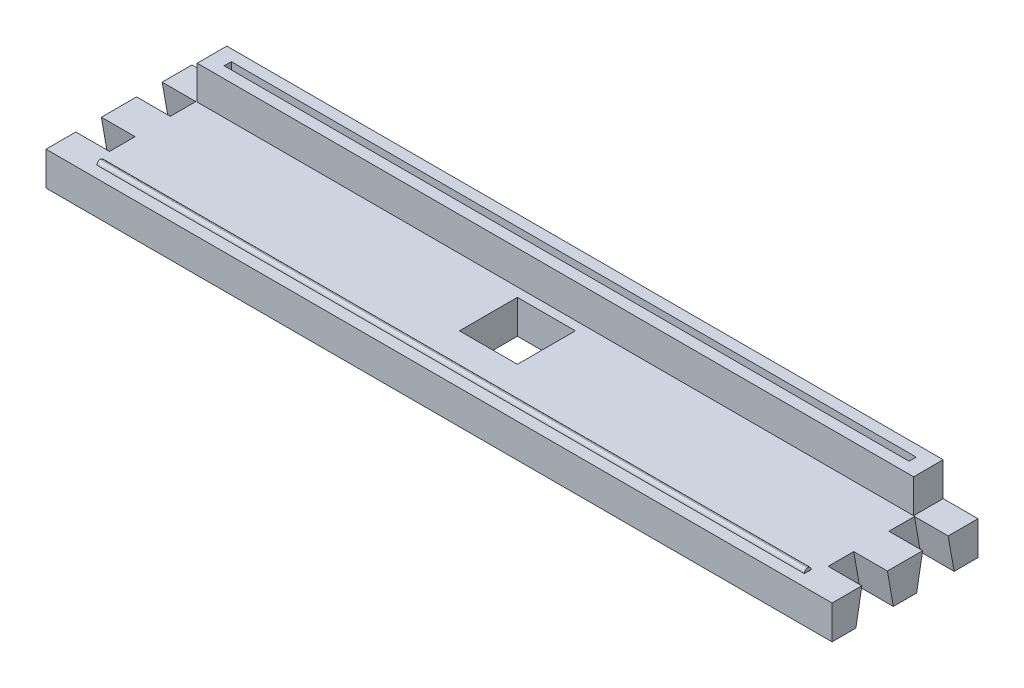
ISO-10303-21;
HEADER;
FILE_DESCRIPTION(('STEP AP214'),'2;1');
FILE_NAME('part.step','',(''),(''),'','','');
FILE_SCHEMA(('AUTOMOTIVE_DESIGN { 1 0 10303 214 1 1 1 1 }'));
ENDSEC;
DATA;
#1=APPLICATION_CONTEXT('core data for automotive mechanical design processes');
#2=APPLICATION_PROTOCOL_DEFINITION('international standard','automotive_design',2000,#1);
#3=PRODUCT_CONTEXT('',#1,'mechanical');
#4=PRODUCT('Part','Part','',(#3));
#5=PRODUCT_RELATED_PRODUCT_CATEGORY('part','',(#4));
#6=PRODUCT_DEFINITION_FORMATION('','',#4);
#7=PRODUCT_DEFINITION_CONTEXT('part definition',#1,'design');
#8=PRODUCT_DEFINITION('design','',#6,#7);
#9=PRODUCT_DEFINITION_SHAPE('','',#8);
#10=(LENGTH_UNIT() NAMED_UNIT(*) SI_UNIT(.MILLI.,.METRE.));
#11=(NAMED_UNIT(*) PLANE_ANGLE_UNIT() SI_UNIT($,.RADIAN.));
#12=(NAMED_UNIT(*) SI_UNIT($,.STERADIAN.) SOLID_ANGLE_UNIT());
#13=UNCERTAINTY_MEASURE_WITH_UNIT(LENGTH_MEASURE(1.E-05),#10,'distance_accuracy_value','');
#14=(GEOMETRIC_REPRESENTATION_CONTEXT(3) GLOBAL_UNCERTAINTY_ASSIGNED_CONTEXT((#13)) GLOBAL_UNIT_ASSIGNED_CONTEXT((#10,
#11,#12)) REPRESENTATION_CONTEXT('',''));
#15=CARTESIAN_POINT('',(0.,0.,0.));
#16=DIRECTION('',(0.,0.,1.));
#17=DIRECTION('',(1.,0.,0.));
#18=AXIS2_PLACEMENT_3D('',#15,#16,#17);
#19=CARTESIAN_POINT('',(0.,0.,0.));
#20=DIRECTION('',(0.,1.,0.));
#21=DIRECTION('',(0.,0.,1.));
#22=AXIS2_PLACEMENT_3D('',#19,#20,#21);
#23=PLANE('',#22);
#24=DIRECTION('',(0.,0.,-1.));
#25=VECTOR('',#24,1.);
#26=CARTESIAN_POINT('',(315.,0.,0.));
#27=LINE('',#26,#25);
#28=CARTESIAN_POINT('',(315.,0.,54.66));
#29=VERTEX_POINT('',#28);
#30=CARTESIAN_POINT('',(315.,0.,48.46));
#31=VERTEX_POINT('',#30);
#32=EDGE_CURVE('E335',#29,#31,#27,.T.);
#33=ORIENTED_EDGE('',*,*,#32,.F.);
#34=DIRECTION('',(1.,0.,0.));
#35=VECTOR('',#34,1.);
#36=CARTESIAN_POINT('',(0.,0.,54.66));
#37=LINE('',#36,#35);
#38=CARTESIAN_POINT('',(-315.,0.,54.66));
#39=VERTEX_POINT('',#38);
#40=EDGE_CURVE('E324',#39,#29,#37,.T.);
#41=ORIENTED_EDGE('',*,*,#40,.F.);
#42=DIRECTION('',(0.,0.,-1.));
#43=VECTOR('',#42,1.);
#44=CARTESIAN_POINT('',(-315.,0.,0.));
#45=LINE('',#44,#43);
#46=CARTESIAN_POINT('',(-315.,0.,48.46));
#47=VERTEX_POINT('',#46);
#48=EDGE_CURVE('E329',#39,#47,#45,.T.);
#49=ORIENTED_EDGE('',*,*,#48,.T.);
#50=DIRECTION('',(1.,0.,0.));
#51=VECTOR('',#50,1.);
#52=CARTESIAN_POINT('',(0.,0.,48.46));
#53=LINE('',#52,#51);
#54=EDGE_CURVE('E338',#47,#31,#53,.T.);
#55=ORIENTED_EDGE('',*,*,#54,.T.);
#56=EDGE_LOOP('',(#33,#41,#49,#55));
#57=FACE_BOUND('',#56,.T.);
#58=DIRECTION('',(0.,0.,-1.));
#59=VECTOR('',#58,1.);
#60=CARTESIAN_POINT('',(25.815,0.,0.));
#61=LINE('',#60,#59);
#62=CARTESIAN_POINT('',(25.815,0.,21.));
#63=VERTEX_POINT('',#62);
#64=CARTESIAN_POINT('',(25.815,0.,-30.63));
#65=VERTEX_POINT('',#64);
#66=EDGE_CURVE('E444',#63,#65,#61,.T.);
#67=ORIENTED_EDGE('',*,*,#66,.F.);
#68=DIRECTION('',(1.,0.,0.));
#69=VECTOR('',#68,1.);
#70=CARTESIAN_POINT('',(0.,0.,21.));
#71=LINE('',#70,#69);
#72=CARTESIAN_POINT('',(-25.815,0.,21.));
#73=VERTEX_POINT('',#72);
#74=EDGE_CURVE('E447',#73,#63,#71,.T.);
#75=ORIENTED_EDGE('',*,*,#74,.F.);
#76=DIRECTION('',(0.,0.,-1.));
#77=VECTOR('',#76,1.);
#78=CARTESIAN_POINT('',(-25.815,0.,0.));
#79=LINE('',#78,#77);
#80=CARTESIAN_POINT('',(-25.815,0.,-30.63));
#81=VERTEX_POINT('',#80);
#82=EDGE_CURVE('E449',#73,#81,#79,.T.);
#83=ORIENTED_EDGE('',*,*,#82,.T.);
#84=DIRECTION('',(1.,0.,0.));
#85=VECTOR('',#84,1.);
#86=CARTESIAN_POINT('',(0.,0.,-30.63));
#87=LINE('',#86,#85);
#88=EDGE_CURVE('E346',#81,#65,#87,.T.);
#89=ORIENTED_EDGE('',*,*,#88,.T.);
#90=EDGE_LOOP('',(#67,#75,#83,#89));
#91=FACE_BOUND('',#90,.T.);
#92=DIRECTION('',(1.,0.,0.));
#93=VECTOR('',#92,1.);
#94=CARTESIAN_POINT('',(0.,0.,-65.));
#95=LINE('',#94,#93);
#96=CARTESIAN_POINT('',(319.,0.,-65.));
#97=VERTEX_POINT('',#96);
#98=CARTESIAN_POINT('',(350.,0.,-65.));
#99=VERTEX_POINT('',#98);
#100=EDGE_CURVE('E392',#97,#99,#95,.T.);
#101=ORIENTED_EDGE('',*,*,#100,.F.);
#102=DIRECTION('',(0.,0.,-1.));
#103=VECTOR('',#102,1.);
#104=CARTESIAN_POINT('',(319.,0.,0.));
#105=LINE('',#104,#103);
#106=CARTESIAN_POINT('',(319.,0.,-38.65));
#107=VERTEX_POINT('',#106);
#108=EDGE_CURVE('E50',#107,#97,#105,.T.);
#109=ORIENTED_EDGE('',*,*,#108,.F.);
#110=DIRECTION('',(1.,0.,0.));
#111=VECTOR('',#110,1.);
#112=CARTESIAN_POINT('',(0.,0.,-38.65));
#113=LINE('',#112,#111);
#114=CARTESIAN_POINT('',(-319.,0.,-38.65));
#115=VERTEX_POINT('',#114);
#116=EDGE_CURVE('E311',#115,#107,#113,.T.);
#117=ORIENTED_EDGE('',*,*,#116,.F.);
#118=DIRECTION('',(0.,0.,-1.));
#119=VECTOR('',#118,1.);
#120=CARTESIAN_POINT('',(-319.,0.,0.));
#121=LINE('',#120,#119);
#122=CARTESIAN_POINT('',(-319.,0.,-65.));
#123=VERTEX_POINT('',#122);
#124=EDGE_CURVE('E290',#115,#123,#121,.T.);
#125=ORIENTED_EDGE('',*,*,#124,.T.);
#126=CARTESIAN_POINT('',(-350.,0.,-65.));
#127=VERTEX_POINT('',#126);
#128=EDGE_CURVE('E393',#127,#123,#95,.T.);
#129=ORIENTED_EDGE('',*,*,#128,.F.);
#130=DIRECTION('',(0.,0.,-1.));
#131=VECTOR('',#130,1.);
#132=CARTESIAN_POINT('',(-350.,0.,0.));
#133=LINE('',#132,#131);
#134=CARTESIAN_POINT('',(-350.,0.,-38.442));
#135=VERTEX_POINT('',#134);
#136=EDGE_CURVE('E396',#135,#127,#133,.T.);
#137=ORIENTED_EDGE('',*,*,#136,.F.);
#138=DIRECTION('',(-1.,0.,0.));
#139=VECTOR('',#138,1.);
#140=CARTESIAN_POINT('',(0.,0.,-38.442));
#141=LINE('',#140,#139);
#142=CARTESIAN_POINT('',(-320.,0.,-38.442));
#143=VERTEX_POINT('',#142);
#144=EDGE_CURVE('E398',#143,#135,#141,.T.);
#145=ORIENTED_EDGE('',*,*,#144,.F.);
#146=DIRECTION('',(0.,0.,1.));
#147=VECTOR('',#146,1.);
#148=CARTESIAN_POINT('',(-320.,0.,0.));
#149=LINE('',#148,#147);
#150=CARTESIAN_POINT('',(-320.,0.,-15.674));
#151=VERTEX_POINT('',#150);
#152=EDGE_CURVE('E401',#143,#151,#149,.T.);
#153=ORIENTED_EDGE('',*,*,#152,.T.);
#154=DIRECTION('',(-1.,0.,0.));
#155=VECTOR('',#154,1.);
#156=CARTESIAN_POINT('',(0.,0.,-15.674));
#157=LINE('',#156,#155);
#158=CARTESIAN_POINT('',(-350.,0.,-15.674));
#159=VERTEX_POINT('',#158);
#160=EDGE_CURVE('E404',#151,#159,#157,.T.);
#161=ORIENTED_EDGE('',*,*,#160,.T.);
#162=DIRECTION('',(0.,0.,-1.));
#163=VECTOR('',#162,1.);
#164=CARTESIAN_POINT('',(-350.,0.,0.));
#165=LINE('',#164,#163);
#166=CARTESIAN_POINT('',(-350.,0.,15.674));
#167=VERTEX_POINT('',#166);
#168=EDGE_CURVE('E408',#167,#159,#165,.T.);
#169=ORIENTED_EDGE('',*,*,#168,.F.);
#170=DIRECTION('',(-1.,0.,0.));
#171=VECTOR('',#170,1.);
#172=CARTESIAN_POINT('',(0.,0.,15.674));
#173=LINE('',#172,#171);
#174=CARTESIAN_POINT('',(-320.,0.,15.674));
#175=VERTEX_POINT('',#174);
#176=EDGE_CURVE('E411',#175,#167,#173,.T.);
#177=ORIENTED_EDGE('',*,*,#176,.F.);
#178=CARTESIAN_POINT('',(-320.,0.,38.442));
#179=VERTEX_POINT('',#178);
#180=EDGE_CURVE('E405',#175,#179,#149,.T.);
#181=ORIENTED_EDGE('',*,*,#180,.T.);
#182=DIRECTION('',(-1.,0.,0.));
#183=VECTOR('',#182,1.);
#184=CARTESIAN_POINT('',(0.,0.,38.442));
#185=LINE('',#184,#183);
#186=CARTESIAN_POINT('',(-350.,0.,38.4420000000001));
#187=VERTEX_POINT('',#186);
#188=EDGE_CURVE('E414',#179,#187,#185,.T.);
#189=ORIENTED_EDGE('',*,*,#188,.T.);
#190=DIRECTION('',(0.,0.,-1.));
#191=VECTOR('',#190,1.);
#192=CARTESIAN_POINT('',(-350.,0.,0.));
#193=LINE('',#192,#191);
#194=CARTESIAN_POINT('',(-350.,0.,65.));
#195=VERTEX_POINT('',#194);
#196=EDGE_CURVE('E417',#195,#187,#193,.T.);
#197=ORIENTED_EDGE('',*,*,#196,.F.);
#198=DIRECTION('',(1.,0.,0.));
#199=VECTOR('',#198,1.);
#200=CARTESIAN_POINT('',(0.,0.,65.));
#201=LINE('',#200,#199);
#202=CARTESIAN_POINT('',(350.,0.,65.));
#203=VERTEX_POINT('',#202);
#204=EDGE_CURVE('E420',#195,#203,#201,.T.);
#205=ORIENTED_EDGE('',*,*,#204,.T.);
#206=DIRECTION('',(0.,0.,-1.));
#207=VECTOR('',#206,1.);
#208=CARTESIAN_POINT('',(350.,0.,0.));
#209=LINE('',#208,#207);
#210=CARTESIAN_POINT('',(350.,0.,38.442));
#211=VERTEX_POINT('',#210);
#212=EDGE_CURVE('E423',#203,#211,#209,.T.);
#213=ORIENTED_EDGE('',*,*,#212,.T.);
#214=DIRECTION('',(1.,0.,0.));
#215=VECTOR('',#214,1.);
#216=CARTESIAN_POINT('',(0.,0.,38.442));
#217=LINE('',#216,#215);
#218=CARTESIAN_POINT('',(320.,0.,38.442));
#219=VERTEX_POINT('',#218);
#220=EDGE_CURVE('E426',#219,#211,#217,.T.);
#221=ORIENTED_EDGE('',*,*,#220,.F.);
#222=DIRECTION('',(0.,0.,1.));
#223=VECTOR('',#222,1.);
#224=CARTESIAN_POINT('',(320.,0.,0.));
#225=LINE('',#224,#223);
#226=CARTESIAN_POINT('',(320.,0.,15.674));
#227=VERTEX_POINT('',#226);
#228=EDGE_CURVE('E429',#227,#219,#225,.T.);
#229=ORIENTED_EDGE('',*,*,#228,.F.);
#230=DIRECTION('',(1.,0.,0.));
#231=VECTOR('',#230,1.);
#232=CARTESIAN_POINT('',(0.,0.,15.674));
#233=LINE('',#232,#231);
#234=CARTESIAN_POINT('',(350.,0.,15.674));
#235=VERTEX_POINT('',#234);
#236=EDGE_CURVE('E431',#227,#235,#233,.T.);
#237=ORIENTED_EDGE('',*,*,#236,.T.);
#238=DIRECTION('',(0.,0.,-1.));
#239=VECTOR('',#238,1.);
#240=CARTESIAN_POINT('',(350.,0.,0.));
#241=LINE('',#240,#239);
#242=CARTESIAN_POINT('',(350.,0.,-15.674));
#243=VERTEX_POINT('',#242);
#244=EDGE_CURVE('E435',#235,#243,#241,.T.);
#245=ORIENTED_EDGE('',*,*,#244,.T.);
#246=DIRECTION('',(1.,0.,0.));
#247=VECTOR('',#246,1.);
#248=CARTESIAN_POINT('',(0.,0.,-15.674));
#249=LINE('',#248,#247);
#250=CARTESIAN_POINT('',(320.,0.,-15.674));
#251=VERTEX_POINT('',#250);
#252=EDGE_CURVE('E438',#251,#243,#249,.T.);
#253=ORIENTED_EDGE('',*,*,#252,.F.);
#254=CARTESIAN_POINT('',(320.,0.,-38.442));
#255=VERTEX_POINT('',#254);
#256=EDGE_CURVE('E432',#255,#251,#225,.T.);
#257=ORIENTED_EDGE('',*,*,#256,.F.);
#258=DIRECTION('',(1.,0.,0.));
#259=VECTOR('',#258,1.);
#260=CARTESIAN_POINT('',(0.,0.,-38.442));
#261=LINE('',#260,#259);
#262=CARTESIAN_POINT('',(350.,0.,-38.442));
#263=VERTEX_POINT('',#262);
#264=EDGE_CURVE('E441',#255,#263,#261,.T.);
#265=ORIENTED_EDGE('',*,*,#264,.T.);
#266=DIRECTION('',(0.,0.,-1.));
#267=VECTOR('',#266,1.);
#268=CARTESIAN_POINT('',(350.,0.,0.));
#269=LINE('',#268,#267);
#270=EDGE_CURVE('E332',#263,#99,#269,.T.);
#271=ORIENTED_EDGE('',*,*,#270,.T.);
#272=EDGE_LOOP('',(#101,#109,#117,#125,#129,#137,#145,#153,#161,#169,#177,#181,#189,#197,#205,
#213,#221,#229,#237,#245,#253,#257,#265,#271));
#273=FACE_BOUND('',#272,.T.);
#274=ADVANCED_FACE('F35',(#57,#91,#273),#23,.T.);
#275=CARTESIAN_POINT('',(305.,-30.,0.));
#276=DIRECTION('',(1.,0.,0.));
#277=DIRECTION('',(0.,0.,-1.));
#278=AXIS2_PLACEMENT_3D('',#275,#276,#277);
#279=PLANE('',#278);
#280=DIRECTION('',(0.,1.,0.));
#281=VECTOR('',#280,1.);
#282=CARTESIAN_POINT('',(305.,-30.,-48.65));
#283=LINE('',#282,#281);
#284=CARTESIAN_POINT('',(305.,-30.,-48.65));
#285=VERTEX_POINT('',#284);
#286=CARTESIAN_POINT('',(305.,30.,-48.65));
#287=VERTEX_POINT('',#286);
#288=EDGE_CURVE('E269',#285,#287,#283,.T.);
#289=ORIENTED_EDGE('',*,*,#288,.T.);
#290=DIRECTION('',(0.,0.,-1.));
#291=VECTOR('',#290,1.);
#292=CARTESIAN_POINT('',(305.,30.,0.));
#293=LINE('',#292,#291);
#294=CARTESIAN_POINT('',(305.,30.,-55.));
#295=VERTEX_POINT('',#294);
#296=EDGE_CURVE('E273',#287,#295,#293,.T.);
#297=ORIENTED_EDGE('',*,*,#296,.T.);
#298=DIRECTION('',(0.,1.,0.));
#299=VECTOR('',#298,1.);
#300=CARTESIAN_POINT('',(305.,-30.,-55.));
#301=LINE('',#300,#299);
#302=CARTESIAN_POINT('',(305.,-30.,-55.));
#303=VERTEX_POINT('',#302);
#304=EDGE_CURVE('E454',#303,#295,#301,.T.);
#305=ORIENTED_EDGE('',*,*,#304,.F.);
#306=DIRECTION('',(0.,0.,-1.));
#307=VECTOR('',#306,1.);
#308=CARTESIAN_POINT('',(305.,-30.,0.));
#309=LINE('',#308,#307);
#310=EDGE_CURVE('E274',#285,#303,#309,.T.);
#311=ORIENTED_EDGE('',*,*,#310,.F.);
#312=EDGE_LOOP('',(#289,#297,#305,#311));
#313=FACE_BOUND('',#312,.T.);
#314=ADVANCED_FACE('F271',(#313),#279,.F.);
#315=CARTESIAN_POINT('',(0.,-30.,-55.));
#316=DIRECTION('',(0.,0.,1.));
#317=DIRECTION('',(1.,0.,0.));
#318=AXIS2_PLACEMENT_3D('',#315,#316,#317);
#319=PLANE('',#318);
#320=ORIENTED_EDGE('',*,*,#304,.T.);
#321=DIRECTION('',(1.,0.,0.));
#322=VECTOR('',#321,1.);
#323=CARTESIAN_POINT('',(0.,30.,-55.));
#324=LINE('',#323,#322);
#325=CARTESIAN_POINT('',(-305.,30.,-55.));
#326=VERTEX_POINT('',#325);
#327=EDGE_CURVE('E289',#326,#295,#324,.T.);
#328=ORIENTED_EDGE('',*,*,#327,.F.);
#329=DIRECTION('',(0.,1.,0.));
#330=VECTOR('',#329,1.);
#331=CARTESIAN_POINT('',(-305.,-30.,-55.));
#332=LINE('',#331,#330);
#333=CARTESIAN_POINT('',(-305.,-30.,-55.));
#334=VERTEX_POINT('',#333);
#335=EDGE_CURVE('E457',#334,#326,#332,.T.);
#336=ORIENTED_EDGE('',*,*,#335,.F.);
#337=DIRECTION('',(1.,0.,0.));
#338=VECTOR('',#337,1.);
#339=CARTESIAN_POINT('',(0.,-30.,-55.));
#340=LINE('',#339,#338);
#341=EDGE_CURVE('E386',#334,#303,#340,.T.);
#342=ORIENTED_EDGE('',*,*,#341,.T.);
#343=EDGE_LOOP('',(#320,#328,#336,#342));
#344=FACE_BOUND('',#343,.T.);
#345=ADVANCED_FACE('F651',(#344),#319,.T.);
#346=CARTESIAN_POINT('',(-305.,-30.,0.));
#347=DIRECTION('',(1.,0.,0.));
#348=DIRECTION('',(0.,0.,-1.));
#349=AXIS2_PLACEMENT_3D('',#346,#347,#348);
#350=PLANE('',#349);
#351=ORIENTED_EDGE('',*,*,#335,.T.);
#352=DIRECTION('',(0.,0.,-1.));
#353=VECTOR('',#352,1.);
#354=CARTESIAN_POINT('',(-305.,30.,0.));
#355=LINE('',#354,#353);
#356=CARTESIAN_POINT('',(-305.,30.,-48.65));
#357=VERTEX_POINT('',#356);
#358=EDGE_CURVE('E294',#357,#326,#355,.T.);
#359=ORIENTED_EDGE('',*,*,#358,.F.);
#360=DIRECTION('',(0.,1.,0.));
#361=VECTOR('',#360,1.);
#362=CARTESIAN_POINT('',(-305.,-30.,-48.65));
#363=LINE('',#362,#361);
#364=CARTESIAN_POINT('',(-305.,-30.,-48.65));
#365=VERTEX_POINT('',#364);
#366=EDGE_CURVE('E278',#365,#357,#363,.T.);
#367=ORIENTED_EDGE('',*,*,#366,.F.);
#368=DIRECTION('',(0.,0.,-1.));
#369=VECTOR('',#368,1.);
#370=CARTESIAN_POINT('',(-305.,-30.,0.));
#371=LINE('',#370,#369);
#372=EDGE_CURVE('E383',#365,#334,#371,.T.);
#373=ORIENTED_EDGE('',*,*,#372,.T.);
#374=EDGE_LOOP('',(#351,#359,#367,#373));
#375=FACE_BOUND('',#374,.T.);
#376=ADVANCED_FACE('F653',(#375),#350,.T.);
#377=CARTESIAN_POINT('',(25.815,-30.,0.));
#378=DIRECTION('',(1.,0.,0.));
#379=DIRECTION('',(0.,0.,-1.));
#380=AXIS2_PLACEMENT_3D('',#377,#378,#379);
#381=PLANE('',#380);
#382=ORIENTED_EDGE('',*,*,#66,.T.);
#383=DIRECTION('',(0.,1.,0.));
#384=VECTOR('',#383,1.);
#385=CARTESIAN_POINT('',(25.815,-30.,-30.63));
#386=LINE('',#385,#384);
#387=CARTESIAN_POINT('',(25.815,-30.,-30.63));
#388=VERTEX_POINT('',#387);
#389=EDGE_CURVE('E279',#388,#65,#386,.T.);
#390=ORIENTED_EDGE('',*,*,#389,.F.);
#391=DIRECTION('',(0.,0.,-1.));
#392=VECTOR('',#391,1.);
#393=CARTESIAN_POINT('',(25.815,-30.,0.));
#394=LINE('',#393,#392);
#395=CARTESIAN_POINT('',(25.815,-30.,21.));
#396=VERTEX_POINT('',#395);
#397=EDGE_CURVE('E370',#396,#388,#394,.T.);
#398=ORIENTED_EDGE('',*,*,#397,.F.);
#399=DIRECTION('',(0.,1.,0.));
#400=VECTOR('',#399,1.);
#401=CARTESIAN_POINT('',(25.815,-30.,21.));
#402=LINE('',#401,#400);
#403=EDGE_CURVE('E465',#396,#63,#402,.T.);
#404=ORIENTED_EDGE('',*,*,#403,.T.);
#405=EDGE_LOOP('',(#382,#390,#398,#404));
#406=FACE_BOUND('',#405,.T.);
#407=ADVANCED_FACE('F655',(#406),#381,.F.);
#408=CARTESIAN_POINT('',(0.,-30.,-30.63));
#409=DIRECTION('',(0.,0.,1.));
#410=DIRECTION('',(1.,0.,0.));
#411=AXIS2_PLACEMENT_3D('',#408,#409,#410);
#412=PLANE('',#411);
#413=ORIENTED_EDGE('',*,*,#88,.F.);
#414=DIRECTION('',(0.,1.,0.));
#415=VECTOR('',#414,1.);
#416=CARTESIAN_POINT('',(-25.815,-30.,-30.63));
#417=LINE('',#416,#415);
#418=CARTESIAN_POINT('',(-25.815,-30.,-30.63));
#419=VERTEX_POINT('',#418);
#420=EDGE_CURVE('E461',#419,#81,#417,.T.);
#421=ORIENTED_EDGE('',*,*,#420,.F.);
#422=DIRECTION('',(1.,0.,0.));
#423=VECTOR('',#422,1.);
#424=CARTESIAN_POINT('',(0.,-30.,-30.63));
#425=LINE('',#424,#423);
#426=EDGE_CURVE('E377',#419,#388,#425,.T.);
#427=ORIENTED_EDGE('',*,*,#426,.T.);
#428=ORIENTED_EDGE('',*,*,#389,.T.);
#429=EDGE_LOOP('',(#413,#421,#427,#428));
#430=FACE_BOUND('',#429,.T.);
#431=ADVANCED_FACE('F661',(#430),#412,.T.);
#432=CARTESIAN_POINT('',(-25.815,-30.,0.));
#433=DIRECTION('',(1.,0.,0.));
#434=DIRECTION('',(0.,0.,-1.));
#435=AXIS2_PLACEMENT_3D('',#432,#433,#434);
#436=PLANE('',#435);
#437=ORIENTED_EDGE('',*,*,#82,.F.);
#438=DIRECTION('',(0.,1.,0.));
#439=VECTOR('',#438,1.);
#440=CARTESIAN_POINT('',(-25.815,-30.,21.));
#441=LINE('',#440,#439);
#442=CARTESIAN_POINT('',(-25.815,-30.,21.));
#443=VERTEX_POINT('',#442);
#444=EDGE_CURVE('E463',#443,#73,#441,.T.);
#445=ORIENTED_EDGE('',*,*,#444,.F.);
#446=DIRECTION('',(0.,0.,-1.));
#447=VECTOR('',#446,1.);
#448=CARTESIAN_POINT('',(-25.815,-30.,0.));
#449=LINE('',#448,#447);
#450=EDGE_CURVE('E374',#443,#419,#449,.T.);
#451=ORIENTED_EDGE('',*,*,#450,.T.);
#452=ORIENTED_EDGE('',*,*,#420,.T.);
#453=EDGE_LOOP('',(#437,#445,#451,#452));
#454=FACE_BOUND('',#453,.T.);
#455=ADVANCED_FACE('F871',(#454),#436,.T.);
#456=CARTESIAN_POINT('',(350.,-30.,0.));
#457=DIRECTION('',(1.,0.,0.));
#458=DIRECTION('',(0.,0.,-1.));
#459=AXIS2_PLACEMENT_3D('',#456,#457,#458);
#460=PLANE('',#459);
#461=ORIENTED_EDGE('',*,*,#270,.F.);
#462=DIRECTION('',(0.,-0.984807753012209,-0.173648177666927));
#463=VECTOR('',#462,1.);
#464=CARTESIAN_POINT('',(350.,-22.5214201369261,-42.4131340140111));
#465=LINE('',#464,#463);
#466=CARTESIAN_POINT('',(350.,-30.,-43.731809421254));
#467=VERTEX_POINT('',#466);
#468=EDGE_CURVE('E520',#263,#467,#465,.T.);
#469=ORIENTED_EDGE('',*,*,#468,.T.);
#470=DIRECTION('',(0.,0.,-1.));
#471=VECTOR('',#470,1.);
#472=CARTESIAN_POINT('',(350.,-30.,0.));
#473=LINE('',#472,#471);
#474=CARTESIAN_POINT('',(350.,-30.,-65.));
#475=VERTEX_POINT('',#474);
#476=EDGE_CURVE('E343',#467,#475,#473,.T.);
#477=ORIENTED_EDGE('',*,*,#476,.T.);
#478=DIRECTION('',(0.,1.,0.));
#479=VECTOR('',#478,1.);
#480=CARTESIAN_POINT('',(350.,-30.,-65.));
#481=LINE('',#480,#479);
#482=EDGE_CURVE('E389',#475,#99,#481,.T.);
#483=ORIENTED_EDGE('',*,*,#482,.T.);
#484=EDGE_LOOP('',(#461,#469,#477,#483));
#485=FACE_BOUND('',#484,.T.);
#486=ADVANCED_FACE('F600',(#485),#460,.T.);
#487=CARTESIAN_POINT('',(320.,-30.,0.));
#488=DIRECTION('',(-1.,0.,0.));
#489=DIRECTION('',(0.,0.,1.));
#490=AXIS2_PLACEMENT_3D('',#487,#488,#489);
#491=PLANE('',#490);
#492=ORIENTED_EDGE('',*,*,#256,.T.);
#493=DIRECTION('',(0.,0.984807753012209,-0.173648177666927));
#494=VECTOR('',#493,1.);
#495=CARTESIAN_POINT('',(320.,-31.7758011750319,-10.0710689192142));
#496=LINE('',#495,#494);
#497=CARTESIAN_POINT('',(320.,-30.,-10.3841905787461));
#498=VERTEX_POINT('',#497);
#499=EDGE_CURVE('E509',#251,#498,#496,.F.);
#500=ORIENTED_EDGE('',*,*,#499,.T.);
#501=DIRECTION('',(0.,0.,1.));
#502=VECTOR('',#501,1.);
#503=CARTESIAN_POINT('',(320.,-30.,0.));
#504=LINE('',#503,#502);
#505=CARTESIAN_POINT('',(320.,-30.,-43.731809421254));
#506=VERTEX_POINT('',#505);
#507=EDGE_CURVE('E58',#506,#498,#504,.T.);
#508=ORIENTED_EDGE('',*,*,#507,.F.);
#509=DIRECTION('',(0.,0.984807753012209,0.173648177666927));
#510=VECTOR('',#509,1.);
#511=CARTESIAN_POINT('',(320.,-22.5214201369261,-42.4131340140111));
#512=LINE('',#511,#510);
#513=EDGE_CURVE('E539',#506,#255,#512,.T.);
#514=ORIENTED_EDGE('',*,*,#513,.T.);
#515=EDGE_LOOP('',(#492,#500,#508,#514));
#516=FACE_BOUND('',#515,.T.);
#517=ADVANCED_FACE('F591',(#516),#491,.F.);
#518=CARTESIAN_POINT('',(350.,-30.,0.));
#519=DIRECTION('',(1.,0.,0.));
#520=DIRECTION('',(0.,0.,-1.));
#521=AXIS2_PLACEMENT_3D('',#518,#519,#520);
#522=PLANE('',#521);
#523=ORIENTED_EDGE('',*,*,#244,.F.);
#524=DIRECTION('',(0.,-0.984807753012209,-0.173648177666927));
#525=VECTOR('',#524,1.);
#526=CARTESIAN_POINT('',(350.,-31.7758011750318,10.0710689192141));
#527=LINE('',#526,#525);
#528=CARTESIAN_POINT('',(350.,-30.,10.384190578746));
#529=VERTEX_POINT('',#528);
#530=EDGE_CURVE('E533',#235,#529,#527,.T.);
#531=ORIENTED_EDGE('',*,*,#530,.T.);
#532=DIRECTION('',(0.,0.,-1.));
#533=VECTOR('',#532,1.);
#534=CARTESIAN_POINT('',(350.,-30.,0.));
#535=LINE('',#534,#533);
#536=CARTESIAN_POINT('',(350.,-30.,-10.3841905787461));
#537=VERTEX_POINT('',#536);
#538=EDGE_CURVE('E368',#529,#537,#535,.T.);
#539=ORIENTED_EDGE('',*,*,#538,.T.);
#540=DIRECTION('',(0.,-0.984807753012209,0.173648177666927));
#541=VECTOR('',#540,1.);
#542=CARTESIAN_POINT('',(350.,-31.7758011750319,-10.0710689192142));
#543=LINE('',#542,#541);
#544=EDGE_CURVE('E501',#537,#243,#543,.F.);
#545=ORIENTED_EDGE('',*,*,#544,.T.);
#546=EDGE_LOOP('',(#523,#531,#539,#545));
#547=FACE_BOUND('',#546,.T.);
#548=ADVANCED_FACE('F583',(#547),#522,.T.);
#549=ORIENTED_EDGE('',*,*,#228,.T.);
#550=DIRECTION('',(0.,0.984807753012209,-0.173648177666927));
#551=VECTOR('',#550,1.);
#552=CARTESIAN_POINT('',(320.,-22.5214201369261,42.413134014011));
#553=LINE('',#552,#551);
#554=CARTESIAN_POINT('',(320.,-30.,43.7318094212539));
#555=VERTEX_POINT('',#554);
#556=EDGE_CURVE('E511',#219,#555,#553,.F.);
#557=ORIENTED_EDGE('',*,*,#556,.T.);
#558=CARTESIAN_POINT('',(320.,-30.,10.384190578746));
#559=VERTEX_POINT('',#558);
#560=EDGE_CURVE('E366',#559,#555,#504,.T.);
#561=ORIENTED_EDGE('',*,*,#560,.F.);
#562=DIRECTION('',(0.,0.984807753012209,0.173648177666927));
#563=VECTOR('',#562,1.);
#564=CARTESIAN_POINT('',(320.,-31.7758011750318,10.0710689192141));
#565=LINE('',#564,#563);
#566=EDGE_CURVE('E541',#559,#227,#565,.T.);
#567=ORIENTED_EDGE('',*,*,#566,.T.);
#568=EDGE_LOOP('',(#549,#557,#561,#567));
#569=FACE_BOUND('',#568,.T.);
#570=ADVANCED_FACE('F574',(#569),#491,.F.);
#571=CARTESIAN_POINT('',(350.,-30.,0.));
#572=DIRECTION('',(1.,0.,0.));
#573=DIRECTION('',(0.,0.,-1.));
#574=AXIS2_PLACEMENT_3D('',#571,#572,#573);
#575=PLANE('',#574);
#576=DIRECTION('',(0.,0.,-1.));
#577=VECTOR('',#576,1.);
#578=CARTESIAN_POINT('',(350.,-30.,0.));
#579=LINE('',#578,#577);
#580=CARTESIAN_POINT('',(350.,-30.,65.));
#581=VERTEX_POINT('',#580);
#582=CARTESIAN_POINT('',(350.,-30.,43.7318094212539));
#583=VERTEX_POINT('',#582);
#584=EDGE_CURVE('E363',#581,#583,#579,.T.);
#585=ORIENTED_EDGE('',*,*,#584,.T.);
#586=DIRECTION('',(0.,-0.984807753012209,0.173648177666927));
#587=VECTOR('',#586,1.);
#588=CARTESIAN_POINT('',(350.,-22.5214201369261,42.413134014011));
#589=LINE('',#588,#587);
#590=EDGE_CURVE('E503',#583,#211,#589,.F.);
#591=ORIENTED_EDGE('',*,*,#590,.T.);
#592=ORIENTED_EDGE('',*,*,#212,.F.);
#593=DIRECTION('',(0.,1.,0.));
#594=VECTOR('',#593,1.);
#595=CARTESIAN_POINT('',(350.,-30.,65.));
#596=LINE('',#595,#594);
#597=EDGE_CURVE('E468',#581,#203,#596,.T.);
#598=ORIENTED_EDGE('',*,*,#597,.F.);
#599=EDGE_LOOP('',(#585,#591,#592,#598));
#600=FACE_BOUND('',#599,.T.);
#601=ADVANCED_FACE('F566',(#600),#575,.T.);
#602=CARTESIAN_POINT('',(0.,-30.,65.));
#603=DIRECTION('',(0.,0.,1.));
#604=DIRECTION('',(1.,0.,0.));
#605=AXIS2_PLACEMENT_3D('',#602,#603,#604);
#606=PLANE('',#605);
#607=ORIENTED_EDGE('',*,*,#204,.F.);
#608=DIRECTION('',(0.,1.,0.));
#609=VECTOR('',#608,1.);
#610=CARTESIAN_POINT('',(-350.,-30.,65.));
#611=LINE('',#610,#609);
#612=CARTESIAN_POINT('',(-350.,-30.,65.));
#613=VERTEX_POINT('',#612);
#614=EDGE_CURVE('E470',#613,#195,#611,.T.);
#615=ORIENTED_EDGE('',*,*,#614,.F.);
#616=DIRECTION('',(1.,0.,0.));
#617=VECTOR('',#616,1.);
#618=CARTESIAN_POINT('',(0.,-30.,65.));
#619=LINE('',#618,#617);
#620=EDGE_CURVE('E360',#613,#581,#619,.T.);
#621=ORIENTED_EDGE('',*,*,#620,.T.);
#622=ORIENTED_EDGE('',*,*,#597,.T.);
#623=EDGE_LOOP('',(#607,#615,#621,#622));
#624=FACE_BOUND('',#623,.T.);
#625=ADVANCED_FACE('F561',(#624),#606,.T.);
#626=CARTESIAN_POINT('',(-350.,-30.,0.));
#627=DIRECTION('',(1.,0.,0.));
#628=DIRECTION('',(0.,0.,-1.));
#629=AXIS2_PLACEMENT_3D('',#626,#627,#628);
#630=PLANE('',#629);
#631=ORIENTED_EDGE('',*,*,#196,.T.);
#632=DIRECTION('',(0.,-0.984807753012209,0.173648177666927));
#633=VECTOR('',#632,1.);
#634=CARTESIAN_POINT('',(-350.,5.967109966055E-13,38.442));
#635=LINE('',#634,#633);
#636=CARTESIAN_POINT('',(-350.,-30.,43.731809421254));
#637=VERTEX_POINT('',#636);
#638=EDGE_CURVE('E535',#187,#637,#635,.T.);
#639=ORIENTED_EDGE('',*,*,#638,.T.);
#640=DIRECTION('',(0.,0.,-1.));
#641=VECTOR('',#640,1.);
#642=CARTESIAN_POINT('',(-350.,-30.,0.));
#643=LINE('',#642,#641);
#644=EDGE_CURVE('E357',#613,#637,#643,.T.);
#645=ORIENTED_EDGE('',*,*,#644,.F.);
#646=ORIENTED_EDGE('',*,*,#614,.T.);
#647=EDGE_LOOP('',(#631,#639,#645,#646));
#648=FACE_BOUND('',#647,.T.);
#649=ADVANCED_FACE('F558',(#648),#630,.F.);
#650=CARTESIAN_POINT('',(-320.,-30.,0.));
#651=DIRECTION('',(-1.,0.,0.));
#652=DIRECTION('',(0.,0.,1.));
#653=AXIS2_PLACEMENT_3D('',#650,#651,#652);
#654=PLANE('',#653);
#655=ORIENTED_EDGE('',*,*,#180,.F.);
#656=DIRECTION('',(0.,0.984807753012209,0.173648177666927));
#657=VECTOR('',#656,1.);
#658=CARTESIAN_POINT('',(-320.,-30.,10.3841905787461));
#659=LINE('',#658,#657);
#660=CARTESIAN_POINT('',(-320.,-30.,10.3841905787461));
#661=VERTEX_POINT('',#660);
#662=EDGE_CURVE('E514',#175,#661,#659,.F.);
#663=ORIENTED_EDGE('',*,*,#662,.T.);
#664=DIRECTION('',(0.,0.,1.));
#665=VECTOR('',#664,1.);
#666=CARTESIAN_POINT('',(-320.,-30.,0.));
#667=LINE('',#666,#665);
#668=CARTESIAN_POINT('',(-320.,-30.,43.731809421254));
#669=VERTEX_POINT('',#668);
#670=EDGE_CURVE('E354',#661,#669,#667,.T.);
#671=ORIENTED_EDGE('',*,*,#670,.T.);
#672=DIRECTION('',(0.,0.984807753012209,-0.173648177666927));
#673=VECTOR('',#672,1.);
#674=CARTESIAN_POINT('',(-320.,5.95524375861732E-13,38.442));
#675=LINE('',#674,#673);
#676=EDGE_CURVE('E43',#669,#179,#675,.T.);
#677=ORIENTED_EDGE('',*,*,#676,.T.);
#678=EDGE_LOOP('',(#655,#663,#671,#677));
#679=FACE_BOUND('',#678,.T.);
#680=ADVANCED_FACE('F546',(#679),#654,.T.);
#681=CARTESIAN_POINT('',(-350.,-30.,0.));
#682=DIRECTION('',(1.,0.,0.));
#683=DIRECTION('',(0.,0.,-1.));
#684=AXIS2_PLACEMENT_3D('',#681,#682,#683);
#685=PLANE('',#684);
#686=ORIENTED_EDGE('',*,*,#168,.T.);
#687=DIRECTION('',(0.,-0.984807753012209,0.173648177666927));
#688=VECTOR('',#687,1.);
#689=CARTESIAN_POINT('',(-350.,5.89789042266854E-13,-15.674));
#690=LINE('',#689,#688);
#691=CARTESIAN_POINT('',(-350.,-30.,-10.384190578746));
#692=VERTEX_POINT('',#691);
#693=EDGE_CURVE('E537',#159,#692,#690,.T.);
#694=ORIENTED_EDGE('',*,*,#693,.T.);
#695=DIRECTION('',(0.,0.,-1.));
#696=VECTOR('',#695,1.);
#697=CARTESIAN_POINT('',(-350.,-30.,0.));
#698=LINE('',#697,#696);
#699=CARTESIAN_POINT('',(-350.,-30.,10.3841905787461));
#700=VERTEX_POINT('',#699);
#701=EDGE_CURVE('E353',#700,#692,#698,.T.);
#702=ORIENTED_EDGE('',*,*,#701,.F.);
#703=DIRECTION('',(0.,-0.984807753012209,-0.173648177666927));
#704=VECTOR('',#703,1.);
#705=CARTESIAN_POINT('',(-350.,-30.,10.3841905787461));
#706=LINE('',#705,#704);
#707=EDGE_CURVE('E505',#700,#167,#706,.F.);
#708=ORIENTED_EDGE('',*,*,#707,.T.);
#709=EDGE_LOOP('',(#686,#694,#702,#708));
#710=FACE_BOUND('',#709,.T.);
#711=ADVANCED_FACE('F634',(#710),#685,.F.);
#712=ORIENTED_EDGE('',*,*,#152,.F.);
#713=DIRECTION('',(0.,0.984807753012209,0.173648177666927));
#714=VECTOR('',#713,1.);
#715=CARTESIAN_POINT('',(-320.,-30.,-43.7318094212539));
#716=LINE('',#715,#714);
#717=CARTESIAN_POINT('',(-320.,-30.,-43.7318094212539));
#718=VERTEX_POINT('',#717);
#719=EDGE_CURVE('E517',#143,#718,#716,.F.);
#720=ORIENTED_EDGE('',*,*,#719,.T.);
#721=CARTESIAN_POINT('',(-320.,-30.,-10.384190578746));
#722=VERTEX_POINT('',#721);
#723=EDGE_CURVE('E351',#718,#722,#667,.T.);
#724=ORIENTED_EDGE('',*,*,#723,.T.);
#725=DIRECTION('',(0.,0.984807753012209,-0.173648177666927));
#726=VECTOR('',#725,1.);
#727=CARTESIAN_POINT('',(-320.,5.8919573189497E-13,-15.674));
#728=LINE('',#727,#726);
#729=EDGE_CURVE('E11',#722,#151,#728,.T.);
#730=ORIENTED_EDGE('',*,*,#729,.T.);
#731=EDGE_LOOP('',(#712,#720,#724,#730));
#732=FACE_BOUND('',#731,.T.);
#733=ADVANCED_FACE('F627',(#732),#654,.T.);
#734=CARTESIAN_POINT('',(-350.,-30.,0.));
#735=DIRECTION('',(1.,0.,0.));
#736=DIRECTION('',(0.,0.,-1.));
#737=AXIS2_PLACEMENT_3D('',#734,#735,#736);
#738=PLANE('',#737);
#739=DIRECTION('',(0.,0.,-1.));
#740=VECTOR('',#739,1.);
#741=CARTESIAN_POINT('',(-350.,-30.,0.));
#742=LINE('',#741,#740);
#743=CARTESIAN_POINT('',(-350.,-30.,-43.7318094212539));
#744=VERTEX_POINT('',#743);
#745=CARTESIAN_POINT('',(-350.,-30.,-65.));
#746=VERTEX_POINT('',#745);
#747=EDGE_CURVE('E349',#744,#746,#742,.T.);
#748=ORIENTED_EDGE('',*,*,#747,.F.);
#749=DIRECTION('',(0.,-0.984807753012209,-0.173648177666927));
#750=VECTOR('',#749,1.);
#751=CARTESIAN_POINT('',(-350.,-30.,-43.7318094212539));
#752=LINE('',#751,#750);
#753=EDGE_CURVE('E507',#744,#135,#752,.F.);
#754=ORIENTED_EDGE('',*,*,#753,.T.);
#755=ORIENTED_EDGE('',*,*,#136,.T.);
#756=DIRECTION('',(0.,1.,0.));
#757=VECTOR('',#756,1.);
#758=CARTESIAN_POINT('',(-350.,-30.,-65.));
#759=LINE('',#758,#757);
#760=EDGE_CURVE('E472',#746,#127,#759,.T.);
#761=ORIENTED_EDGE('',*,*,#760,.F.);
#762=EDGE_LOOP('',(#748,#754,#755,#761));
#763=FACE_BOUND('',#762,.T.);
#764=ADVANCED_FACE('F620',(#763),#738,.F.);
#765=CARTESIAN_POINT('',(0.,-30.,21.));
#766=DIRECTION('',(0.,0.,1.));
#767=DIRECTION('',(1.,0.,0.));
#768=AXIS2_PLACEMENT_3D('',#765,#766,#767);
#769=PLANE('',#768);
#770=ORIENTED_EDGE('',*,*,#74,.T.);
#771=ORIENTED_EDGE('',*,*,#403,.F.);
#772=DIRECTION('',(1.,0.,0.));
#773=VECTOR('',#772,1.);
#774=CARTESIAN_POINT('',(0.,-30.,21.));
#775=LINE('',#774,#773);
#776=EDGE_CURVE('E372',#443,#396,#775,.T.);
#777=ORIENTED_EDGE('',*,*,#776,.F.);
#778=ORIENTED_EDGE('',*,*,#444,.T.);
#779=EDGE_LOOP('',(#770,#771,#777,#778));
#780=FACE_BOUND('',#779,.T.);
#781=ADVANCED_FACE('F803',(#780),#769,.F.);
#782=CARTESIAN_POINT('',(0.,-30.,-65.));
#783=DIRECTION('',(0.,0.,1.));
#784=DIRECTION('',(1.,0.,0.));
#785=AXIS2_PLACEMENT_3D('',#782,#783,#784);
#786=PLANE('',#785);
#787=ORIENTED_EDGE('',*,*,#128,.T.);
#788=DIRECTION('',(0.,-1.,0.));
#789=VECTOR('',#788,1.);
#790=CARTESIAN_POINT('',(-319.,30.,-65.));
#791=LINE('',#790,#789);
#792=CARTESIAN_POINT('',(-319.,30.,-65.));
#793=VERTEX_POINT('',#792);
#794=EDGE_CURVE('E318',#793,#123,#791,.T.);
#795=ORIENTED_EDGE('',*,*,#794,.F.);
#796=DIRECTION('',(1.,0.,0.));
#797=VECTOR('',#796,1.);
#798=CARTESIAN_POINT('',(0.,30.,-65.));
#799=LINE('',#798,#797);
#800=CARTESIAN_POINT('',(319.,30.,-65.));
#801=VERTEX_POINT('',#800);
#802=EDGE_CURVE('E304',#793,#801,#799,.T.);
#803=ORIENTED_EDGE('',*,*,#802,.T.);
#804=DIRECTION('',(0.,-1.,0.));
#805=VECTOR('',#804,1.);
#806=CARTESIAN_POINT('',(319.,30.,-65.));
#807=LINE('',#806,#805);
#808=EDGE_CURVE('E320',#801,#97,#807,.T.);
#809=ORIENTED_EDGE('',*,*,#808,.T.);
#810=ORIENTED_EDGE('',*,*,#100,.T.);
#811=ORIENTED_EDGE('',*,*,#482,.F.);
#812=DIRECTION('',(1.,0.,0.));
#813=VECTOR('',#812,1.);
#814=CARTESIAN_POINT('',(0.,-30.,-65.));
#815=LINE('',#814,#813);
#816=EDGE_CURVE('E345',#746,#475,#815,.T.);
#817=ORIENTED_EDGE('',*,*,#816,.F.);
#818=ORIENTED_EDGE('',*,*,#760,.T.);
#819=EDGE_LOOP('',(#787,#795,#803,#809,#810,#811,#817,#818));
#820=FACE_BOUND('',#819,.T.);
#821=ADVANCED_FACE('F604',(#820),#786,.F.);
#822=CARTESIAN_POINT('',(0.,-30.,-48.65));
#823=DIRECTION('',(0.,0.,1.));
#824=DIRECTION('',(1.,0.,0.));
#825=AXIS2_PLACEMENT_3D('',#822,#823,#824);
#826=PLANE('',#825);
#827=ORIENTED_EDGE('',*,*,#366,.T.);
#828=DIRECTION('',(1.,0.,0.));
#829=VECTOR('',#828,1.);
#830=CARTESIAN_POINT('',(0.,30.,-48.65));
#831=LINE('',#830,#829);
#832=EDGE_CURVE('E287',#357,#287,#831,.T.);
#833=ORIENTED_EDGE('',*,*,#832,.T.);
#834=ORIENTED_EDGE('',*,*,#288,.F.);
#835=DIRECTION('',(1.,0.,0.));
#836=VECTOR('',#835,1.);
#837=CARTESIAN_POINT('',(0.,-30.,-48.65));
#838=LINE('',#837,#836);
#839=EDGE_CURVE('E381',#365,#285,#838,.T.);
#840=ORIENTED_EDGE('',*,*,#839,.F.);
#841=EDGE_LOOP('',(#827,#833,#834,#840));
#842=FACE_BOUND('',#841,.T.);
#843=ADVANCED_FACE('F292',(#842),#826,.F.);
#844=CARTESIAN_POINT('',(0.,-30.,0.));
#845=DIRECTION('',(0.,1.,0.));
#846=DIRECTION('',(0.,0.,1.));
#847=AXIS2_PLACEMENT_3D('',#844,#845,#846);
#848=PLANE('',#847);
#849=ORIENTED_EDGE('',*,*,#476,.F.);
#850=DIRECTION('',(-1.,0.,0.));
#851=VECTOR('',#850,1.);
#852=CARTESIAN_POINT('',(320.,-30.,-43.731809421254));
#853=LINE('',#852,#851);
#854=EDGE_CURVE('E531',#467,#506,#853,.T.);
#855=ORIENTED_EDGE('',*,*,#854,.T.);
#856=ORIENTED_EDGE('',*,*,#507,.T.);
#857=DIRECTION('',(1.,0.,0.));
#858=VECTOR('',#857,1.);
#859=CARTESIAN_POINT('',(0.,-30.,-10.3841905787461));
#860=LINE('',#859,#858);
#861=EDGE_CURVE('E498',#498,#537,#860,.T.);
#862=ORIENTED_EDGE('',*,*,#861,.T.);
#863=ORIENTED_EDGE('',*,*,#538,.F.);
#864=DIRECTION('',(-1.,0.,0.));
#865=VECTOR('',#864,1.);
#866=CARTESIAN_POINT('',(320.,-30.,10.384190578746));
#867=LINE('',#866,#865);
#868=EDGE_CURVE('E528',#529,#559,#867,.T.);
#869=ORIENTED_EDGE('',*,*,#868,.T.);
#870=ORIENTED_EDGE('',*,*,#560,.T.);
#871=DIRECTION('',(1.,0.,0.));
#872=VECTOR('',#871,1.);
#873=CARTESIAN_POINT('',(0.,-30.,43.7318094212539));
#874=LINE('',#873,#872);
#875=EDGE_CURVE('E495',#555,#583,#874,.T.);
#876=ORIENTED_EDGE('',*,*,#875,.T.);
#877=ORIENTED_EDGE('',*,*,#584,.F.);
#878=ORIENTED_EDGE('',*,*,#620,.F.);
#879=ORIENTED_EDGE('',*,*,#644,.T.);
#880=DIRECTION('',(1.,0.,0.));
#881=VECTOR('',#880,1.);
#882=CARTESIAN_POINT('',(-320.,-30.,43.731809421254));
#883=LINE('',#882,#881);
#884=EDGE_CURVE('E525',#637,#669,#883,.T.);
#885=ORIENTED_EDGE('',*,*,#884,.T.);
#886=ORIENTED_EDGE('',*,*,#670,.F.);
#887=DIRECTION('',(-1.,0.,0.));
#888=VECTOR('',#887,1.);
#889=CARTESIAN_POINT('',(0.,-30.,10.384190578746));
#890=LINE('',#889,#888);
#891=EDGE_CURVE('E492',#661,#700,#890,.T.);
#892=ORIENTED_EDGE('',*,*,#891,.T.);
#893=ORIENTED_EDGE('',*,*,#701,.T.);
#894=DIRECTION('',(1.,0.,0.));
#895=VECTOR('',#894,1.);
#896=CARTESIAN_POINT('',(-320.,-30.,-10.384190578746));
#897=LINE('',#896,#895);
#898=EDGE_CURVE('E522',#692,#722,#897,.T.);
#899=ORIENTED_EDGE('',*,*,#898,.T.);
#900=ORIENTED_EDGE('',*,*,#723,.F.);
#901=DIRECTION('',(-1.,0.,0.));
#902=VECTOR('',#901,1.);
#903=CARTESIAN_POINT('',(0.,-30.,-43.731809421254));
#904=LINE('',#903,#902);
#905=EDGE_CURVE('E489',#718,#744,#904,.T.);
#906=ORIENTED_EDGE('',*,*,#905,.T.);
#907=ORIENTED_EDGE('',*,*,#747,.T.);
#908=ORIENTED_EDGE('',*,*,#816,.T.);
#909=EDGE_LOOP('',(#849,#855,#856,#862,#863,#869,#870,#876,#877,#878,#879,#885,#886,#892,#893,
#899,#900,#906,#907,#908));
#910=FACE_BOUND('',#909,.T.);
#911=ORIENTED_EDGE('',*,*,#397,.T.);
#912=ORIENTED_EDGE('',*,*,#426,.F.);
#913=ORIENTED_EDGE('',*,*,#450,.F.);
#914=ORIENTED_EDGE('',*,*,#776,.T.);
#915=EDGE_LOOP('',(#911,#912,#913,#914));
#916=FACE_BOUND('',#915,.T.);
#917=ORIENTED_EDGE('',*,*,#310,.T.);
#918=ORIENTED_EDGE('',*,*,#341,.F.);
#919=ORIENTED_EDGE('',*,*,#372,.F.);
#920=ORIENTED_EDGE('',*,*,#839,.T.);
#921=EDGE_LOOP('',(#917,#918,#919,#920));
#922=FACE_BOUND('',#921,.T.);
#923=ADVANCED_FACE('F639',(#910,#916,#922),#848,.F.);
#924=CARTESIAN_POINT('',(315.,3.,0.));
#925=DIRECTION('',(-1.,0.,0.));
#926=DIRECTION('',(0.,0.,1.));
#927=AXIS2_PLACEMENT_3D('',#924,#925,#926);
#928=PLANE('',#927);
#929=ORIENTED_EDGE('',*,*,#32,.T.);
#930=CARTESIAN_POINT('',(315.,0.,51.4600000000001));
#931=DIRECTION('',(-1.,0.,0.));
#932=DIRECTION('',(0.,0.,1.));
#933=AXIS2_PLACEMENT_3D('',#930,#931,#932);
#934=CIRCLE('',#933,3.);
#935=CARTESIAN_POINT('',(315.,3.,51.4600000000001));
#936=VERTEX_POINT('',#935);
#937=EDGE_CURVE('E478',#31,#936,#934,.F.);
#938=ORIENTED_EDGE('',*,*,#937,.T.);
#939=DIRECTION('',(0.,0.,-1.));
#940=VECTOR('',#939,1.);
#941=CARTESIAN_POINT('',(315.,3.,0.));
#942=LINE('',#941,#940);
#943=CARTESIAN_POINT('',(315.,3.,51.66));
#944=VERTEX_POINT('',#943);
#945=EDGE_CURVE('E325',#944,#936,#942,.T.);
#946=ORIENTED_EDGE('',*,*,#945,.F.);
#947=CARTESIAN_POINT('',(315.,0.,51.66));
#948=DIRECTION('',(-1.,0.,0.));
#949=DIRECTION('',(0.,0.,1.));
#950=AXIS2_PLACEMENT_3D('',#947,#948,#949);
#951=CIRCLE('',#950,3.);
#952=EDGE_CURVE('E456',#944,#29,#951,.F.);
#953=ORIENTED_EDGE('',*,*,#952,.T.);
#954=EDGE_LOOP('',(#929,#938,#946,#953));
#955=FACE_BOUND('',#954,.T.);
#956=ADVANCED_FACE('F642',(#955),#928,.F.);
#957=CARTESIAN_POINT('',(-315.,3.,0.));
#958=DIRECTION('',(-1.,0.,0.));
#959=DIRECTION('',(0.,0.,1.));
#960=AXIS2_PLACEMENT_3D('',#957,#958,#959);
#961=PLANE('',#960);
#962=DIRECTION('',(0.,0.,-1.));
#963=VECTOR('',#962,1.);
#964=CARTESIAN_POINT('',(-315.,3.,0.));
#965=LINE('',#964,#963);
#966=CARTESIAN_POINT('',(-315.,3.,51.66));
#967=VERTEX_POINT('',#966);
#968=CARTESIAN_POINT('',(-315.,3.,51.4600000000001));
#969=VERTEX_POINT('',#968);
#970=EDGE_CURVE('E328',#967,#969,#965,.T.);
#971=ORIENTED_EDGE('',*,*,#970,.T.);
#972=CARTESIAN_POINT('',(-315.,0.,51.4600000000001));
#973=DIRECTION('',(-1.,0.,0.));
#974=DIRECTION('',(0.,0.,1.));
#975=AXIS2_PLACEMENT_3D('',#972,#973,#974);
#976=CIRCLE('',#975,3.);
#977=EDGE_CURVE('E487',#969,#47,#976,.T.);
#978=ORIENTED_EDGE('',*,*,#977,.T.);
#979=ORIENTED_EDGE('',*,*,#48,.F.);
#980=CARTESIAN_POINT('',(-315.,0.,51.66));
#981=DIRECTION('',(-1.,0.,0.));
#982=DIRECTION('',(0.,0.,1.));
#983=AXIS2_PLACEMENT_3D('',#980,#981,#982);
#984=CIRCLE('',#983,3.);
#985=EDGE_CURVE('E485',#39,#967,#984,.T.);
#986=ORIENTED_EDGE('',*,*,#985,.T.);
#987=EDGE_LOOP('',(#971,#978,#979,#986));
#988=FACE_BOUND('',#987,.T.);
#989=ADVANCED_FACE('F678',(#988),#961,.T.);
#990=CARTESIAN_POINT('',(0.,3.,0.));
#991=DIRECTION('',(0.,1.,0.));
#992=DIRECTION('',(0.,0.,1.));
#993=AXIS2_PLACEMENT_3D('',#990,#991,#992);
#994=PLANE('',#993);
#995=ORIENTED_EDGE('',*,*,#945,.T.);
#996=DIRECTION('',(1.,0.,0.));
#997=VECTOR('',#996,1.);
#998=CARTESIAN_POINT('',(0.,3.,51.4600000000001));
#999=LINE('',#998,#997);
#1000=EDGE_CURVE('E483',#936,#969,#999,.F.);
#1001=ORIENTED_EDGE('',*,*,#1000,.T.);
#1002=ORIENTED_EDGE('',*,*,#970,.F.);
#1003=DIRECTION('',(1.,0.,0.));
#1004=VECTOR('',#1003,1.);
#1005=CARTESIAN_POINT('',(315.,3.,51.66));
#1006=LINE('',#1005,#1004);
#1007=EDGE_CURVE('E480',#967,#944,#1006,.T.);
#1008=ORIENTED_EDGE('',*,*,#1007,.T.);
#1009=EDGE_LOOP('',(#995,#1001,#1002,#1008));
#1010=FACE_BOUND('',#1009,.T.);
#1011=ADVANCED_FACE('F682',(#1010),#994,.T.);
#1012=CARTESIAN_POINT('',(0.,0.,51.4600000000001));
#1013=DIRECTION('',(1.,0.,0.));
#1014=DIRECTION('',(0.,0.,-1.));
#1015=AXIS2_PLACEMENT_3D('',#1012,#1013,#1014);
#1016=CYLINDRICAL_SURFACE('',#1015,3.);
#1017=ORIENTED_EDGE('',*,*,#977,.F.);
#1018=ORIENTED_EDGE('',*,*,#1000,.F.);
#1019=ORIENTED_EDGE('',*,*,#937,.F.);
#1020=ORIENTED_EDGE('',*,*,#54,.F.);
#1021=EDGE_LOOP('',(#1017,#1018,#1019,#1020));
#1022=FACE_BOUND('',#1021,.T.);
#1023=ADVANCED_FACE('F686',(#1022),#1016,.T.);
#1024=CARTESIAN_POINT('',(0.,0.,51.66));
#1025=DIRECTION('',(-1.,0.,0.));
#1026=DIRECTION('',(0.,0.,1.));
#1027=AXIS2_PLACEMENT_3D('',#1024,#1025,#1026);
#1028=CYLINDRICAL_SURFACE('',#1027,3.);
#1029=ORIENTED_EDGE('',*,*,#985,.F.);
#1030=ORIENTED_EDGE('',*,*,#40,.T.);
#1031=ORIENTED_EDGE('',*,*,#952,.F.);
#1032=ORIENTED_EDGE('',*,*,#1007,.F.);
#1033=EDGE_LOOP('',(#1029,#1030,#1031,#1032));
#1034=FACE_BOUND('',#1033,.T.);
#1035=ADVANCED_FACE('F759',(#1034),#1028,.T.);
#1036=CARTESIAN_POINT('',(0.,-30.,-10.3841905787461));
#1037=DIRECTION('',(0.,0.173648177666927,0.984807753012208));
#1038=DIRECTION('',(1.,0.,0.));
#1039=AXIS2_PLACEMENT_3D('',#1036,#1037,#1038);
#1040=PLANE('',#1039);
#1041=ORIENTED_EDGE('',*,*,#499,.F.);
#1042=ORIENTED_EDGE('',*,*,#252,.T.);
#1043=ORIENTED_EDGE('',*,*,#544,.F.);
#1044=ORIENTED_EDGE('',*,*,#861,.F.);
#1045=EDGE_LOOP('',(#1041,#1042,#1043,#1044));
#1046=FACE_BOUND('',#1045,.T.);
#1047=ADVANCED_FACE('F589',(#1046),#1040,.F.);
#1048=CARTESIAN_POINT('',(0.,-30.,43.7318094212539));
#1049=DIRECTION('',(0.,0.173648177666927,0.984807753012208));
#1050=DIRECTION('',(1.,0.,0.));
#1051=AXIS2_PLACEMENT_3D('',#1048,#1049,#1050);
#1052=PLANE('',#1051);
#1053=ORIENTED_EDGE('',*,*,#556,.F.);
#1054=ORIENTED_EDGE('',*,*,#220,.T.);
#1055=ORIENTED_EDGE('',*,*,#590,.F.);
#1056=ORIENTED_EDGE('',*,*,#875,.F.);
#1057=EDGE_LOOP('',(#1053,#1054,#1055,#1056));
#1058=FACE_BOUND('',#1057,.T.);
#1059=ADVANCED_FACE('F571',(#1058),#1052,.F.);
#1060=CARTESIAN_POINT('',(0.,-30.,10.384190578746));
#1061=DIRECTION('',(0.,0.173648177666927,-0.984807753012209));
#1062=DIRECTION('',(-1.,0.,0.));
#1063=AXIS2_PLACEMENT_3D('',#1060,#1061,#1062);
#1064=PLANE('',#1063);
#1065=ORIENTED_EDGE('',*,*,#662,.F.);
#1066=ORIENTED_EDGE('',*,*,#176,.T.);
#1067=ORIENTED_EDGE('',*,*,#707,.F.);
#1068=ORIENTED_EDGE('',*,*,#891,.F.);
#1069=EDGE_LOOP('',(#1065,#1066,#1067,#1068));
#1070=FACE_BOUND('',#1069,.T.);
#1071=ADVANCED_FACE('F636',(#1070),#1064,.F.);
#1072=CARTESIAN_POINT('',(0.,-30.,-43.731809421254));
#1073=DIRECTION('',(0.,0.173648177666927,-0.984807753012209));
#1074=DIRECTION('',(-1.,0.,0.));
#1075=AXIS2_PLACEMENT_3D('',#1072,#1073,#1074);
#1076=PLANE('',#1075);
#1077=ORIENTED_EDGE('',*,*,#719,.F.);
#1078=ORIENTED_EDGE('',*,*,#144,.T.);
#1079=ORIENTED_EDGE('',*,*,#753,.F.);
#1080=ORIENTED_EDGE('',*,*,#905,.F.);
#1081=EDGE_LOOP('',(#1077,#1078,#1079,#1080));
#1082=FACE_BOUND('',#1081,.T.);
#1083=ADVANCED_FACE('F624',(#1082),#1076,.F.);
#1084=CARTESIAN_POINT('',(0.,5.82867087928207E-13,-38.442));
#1085=DIRECTION('',(0.,-0.173648177666927,0.984807753012208));
#1086=DIRECTION('',(-1.,0.,0.));
#1087=AXIS2_PLACEMENT_3D('',#1084,#1085,#1086);
#1088=PLANE('',#1087);
#1089=ORIENTED_EDGE('',*,*,#513,.F.);
#1090=ORIENTED_EDGE('',*,*,#854,.F.);
#1091=ORIENTED_EDGE('',*,*,#468,.F.);
#1092=ORIENTED_EDGE('',*,*,#264,.F.);
#1093=EDGE_LOOP('',(#1089,#1090,#1091,#1092));
#1094=FACE_BOUND('',#1093,.T.);
#1095=ADVANCED_FACE('F595',(#1094),#1088,.T.);
#1096=CARTESIAN_POINT('',(0.,6.93889390390723E-13,15.674));
#1097=DIRECTION('',(0.,-0.173648177666927,0.984807753012209));
#1098=DIRECTION('',(-1.,0.,0.));
#1099=AXIS2_PLACEMENT_3D('',#1096,#1097,#1098);
#1100=PLANE('',#1099);
#1101=ORIENTED_EDGE('',*,*,#566,.F.);
#1102=ORIENTED_EDGE('',*,*,#868,.F.);
#1103=ORIENTED_EDGE('',*,*,#530,.F.);
#1104=ORIENTED_EDGE('',*,*,#236,.F.);
#1105=EDGE_LOOP('',(#1101,#1102,#1103,#1104));
#1106=FACE_BOUND('',#1105,.T.);
#1107=ADVANCED_FACE('F578',(#1106),#1100,.T.);
#1108=CARTESIAN_POINT('',(0.,5.82867087928207E-13,38.442));
#1109=DIRECTION('',(0.,-0.173648177666927,-0.984807753012208));
#1110=DIRECTION('',(1.,0.,0.));
#1111=AXIS2_PLACEMENT_3D('',#1108,#1109,#1110);
#1112=PLANE('',#1111);
#1113=ORIENTED_EDGE('',*,*,#676,.F.);
#1114=ORIENTED_EDGE('',*,*,#884,.F.);
#1115=ORIENTED_EDGE('',*,*,#638,.F.);
#1116=ORIENTED_EDGE('',*,*,#188,.F.);
#1117=EDGE_LOOP('',(#1113,#1114,#1115,#1116));
#1118=FACE_BOUND('',#1117,.T.);
#1119=ADVANCED_FACE('F555',(#1118),#1112,.T.);
#1120=CARTESIAN_POINT('',(0.,5.82867087928207E-13,-15.674));
#1121=DIRECTION('',(0.,-0.173648177666927,-0.984807753012208));
#1122=DIRECTION('',(1.,0.,0.));
#1123=AXIS2_PLACEMENT_3D('',#1120,#1121,#1122);
#1124=PLANE('',#1123);
#1125=ORIENTED_EDGE('',*,*,#729,.F.);
#1126=ORIENTED_EDGE('',*,*,#898,.F.);
#1127=ORIENTED_EDGE('',*,*,#693,.F.);
#1128=ORIENTED_EDGE('',*,*,#160,.F.);
#1129=EDGE_LOOP('',(#1125,#1126,#1127,#1128));
#1130=FACE_BOUND('',#1129,.T.);
#1131=ADVANCED_FACE('F37',(#1130),#1124,.T.);
#1132=CARTESIAN_POINT('',(0.,30.,-38.65));
#1133=DIRECTION('',(0.,0.,-1.));
#1134=DIRECTION('',(-1.,0.,0.));
#1135=AXIS2_PLACEMENT_3D('',#1132,#1133,#1134);
#1136=PLANE('',#1135);
#1137=ORIENTED_EDGE('',*,*,#116,.T.);
#1138=DIRECTION('',(0.,-1.,0.));
#1139=VECTOR('',#1138,1.);
#1140=CARTESIAN_POINT('',(319.,30.,-38.65));
#1141=LINE('',#1140,#1139);
#1142=CARTESIAN_POINT('',(319.,30.,-38.65));
#1143=VERTEX_POINT('',#1142);
#1144=EDGE_CURVE('E322',#1143,#107,#1141,.T.);
#1145=ORIENTED_EDGE('',*,*,#1144,.F.);
#1146=DIRECTION('',(1.,0.,0.));
#1147=VECTOR('',#1146,1.);
#1148=CARTESIAN_POINT('',(0.,30.,-38.65));
#1149=LINE('',#1148,#1147);
#1150=CARTESIAN_POINT('',(-319.,30.,-38.65));
#1151=VERTEX_POINT('',#1150);
#1152=EDGE_CURVE('E299',#1151,#1143,#1149,.T.);
#1153=ORIENTED_EDGE('',*,*,#1152,.F.);
#1154=DIRECTION('',(0.,-1.,0.));
#1155=VECTOR('',#1154,1.);
#1156=CARTESIAN_POINT('',(-319.,30.,-38.65));
#1157=LINE('',#1156,#1155);
#1158=EDGE_CURVE('E310',#1151,#115,#1157,.T.);
#1159=ORIENTED_EDGE('',*,*,#1158,.T.);
#1160=EDGE_LOOP('',(#1137,#1145,#1153,#1159));
#1161=FACE_BOUND('',#1160,.T.);
#1162=ADVANCED_FACE('F612',(#1161),#1136,.F.);
#1163=CARTESIAN_POINT('',(319.,30.,0.));
#1164=DIRECTION('',(-1.,0.,0.));
#1165=DIRECTION('',(0.,0.,1.));
#1166=AXIS2_PLACEMENT_3D('',#1163,#1164,#1165);
#1167=PLANE('',#1166);
#1168=ORIENTED_EDGE('',*,*,#108,.T.);
#1169=ORIENTED_EDGE('',*,*,#808,.F.);
#1170=DIRECTION('',(0.,0.,-1.));
#1171=VECTOR('',#1170,1.);
#1172=CARTESIAN_POINT('',(319.,30.,0.));
#1173=LINE('',#1172,#1171);
#1174=EDGE_CURVE('E302',#1143,#801,#1173,.T.);
#1175=ORIENTED_EDGE('',*,*,#1174,.F.);
#1176=ORIENTED_EDGE('',*,*,#1144,.T.);
#1177=EDGE_LOOP('',(#1168,#1169,#1175,#1176));
#1178=FACE_BOUND('',#1177,.T.);
#1179=ADVANCED_FACE('F607',(#1178),#1167,.F.);
#1180=CARTESIAN_POINT('',(-319.,30.,0.));
#1181=DIRECTION('',(-1.,0.,0.));
#1182=DIRECTION('',(0.,0.,1.));
#1183=AXIS2_PLACEMENT_3D('',#1180,#1181,#1182);
#1184=PLANE('',#1183);
#1185=ORIENTED_EDGE('',*,*,#124,.F.);
#1186=ORIENTED_EDGE('',*,*,#1158,.F.);
#1187=DIRECTION('',(0.,0.,-1.));
#1188=VECTOR('',#1187,1.);
#1189=CARTESIAN_POINT('',(-319.,30.,0.));
#1190=LINE('',#1189,#1188);
#1191=EDGE_CURVE('E307',#1151,#793,#1190,.T.);
#1192=ORIENTED_EDGE('',*,*,#1191,.T.);
#1193=ORIENTED_EDGE('',*,*,#794,.T.);
#1194=EDGE_LOOP('',(#1185,#1186,#1192,#1193));
#1195=FACE_BOUND('',#1194,.T.);
#1196=ADVANCED_FACE('F692',(#1195),#1184,.T.);
#1197=CARTESIAN_POINT('',(0.,30.,0.));
#1198=DIRECTION('',(0.,1.,0.));
#1199=DIRECTION('',(0.,0.,1.));
#1200=AXIS2_PLACEMENT_3D('',#1197,#1198,#1199);
#1201=PLANE('',#1200);
#1202=ORIENTED_EDGE('',*,*,#296,.F.);
#1203=ORIENTED_EDGE('',*,*,#832,.F.);
#1204=ORIENTED_EDGE('',*,*,#358,.T.);
#1205=ORIENTED_EDGE('',*,*,#327,.T.);
#1206=EDGE_LOOP('',(#1202,#1203,#1204,#1205));
#1207=FACE_BOUND('',#1206,.T.);
#1208=ORIENTED_EDGE('',*,*,#1152,.T.);
#1209=ORIENTED_EDGE('',*,*,#1174,.T.);
#1210=ORIENTED_EDGE('',*,*,#802,.F.);
#1211=ORIENTED_EDGE('',*,*,#1191,.F.);
#1212=EDGE_LOOP('',(#1208,#1209,#1210,#1211));
#1213=FACE_BOUND('',#1212,.T.);
#1214=ADVANCED_FACE('F284',(#1207,#1213),#1201,.T.);
#1215=CLOSED_SHELL('',(#274,#314,#345,#376,#407,#431,#455,#486,#517,#548,#570,#601,#625,#649,
#680,#711,#733,#764,#781,#821,#843,#923,#956,#989,#1011,#1023,#1035,#1047,#1059,#1071,#1083,
#1095,#1107,#1119,#1131,#1162,#1179,#1196,#1214));
#1216=MANIFOLD_SOLID_BREP('B2',#1215);
#1217=ADVANCED_BREP_SHAPE_REPRESENTATION('',(#18,#1216),#14);
#1218=SHAPE_DEFINITION_REPRESENTATION(#9,#1217);
ENDSEC;
END-ISO-10303-21;
